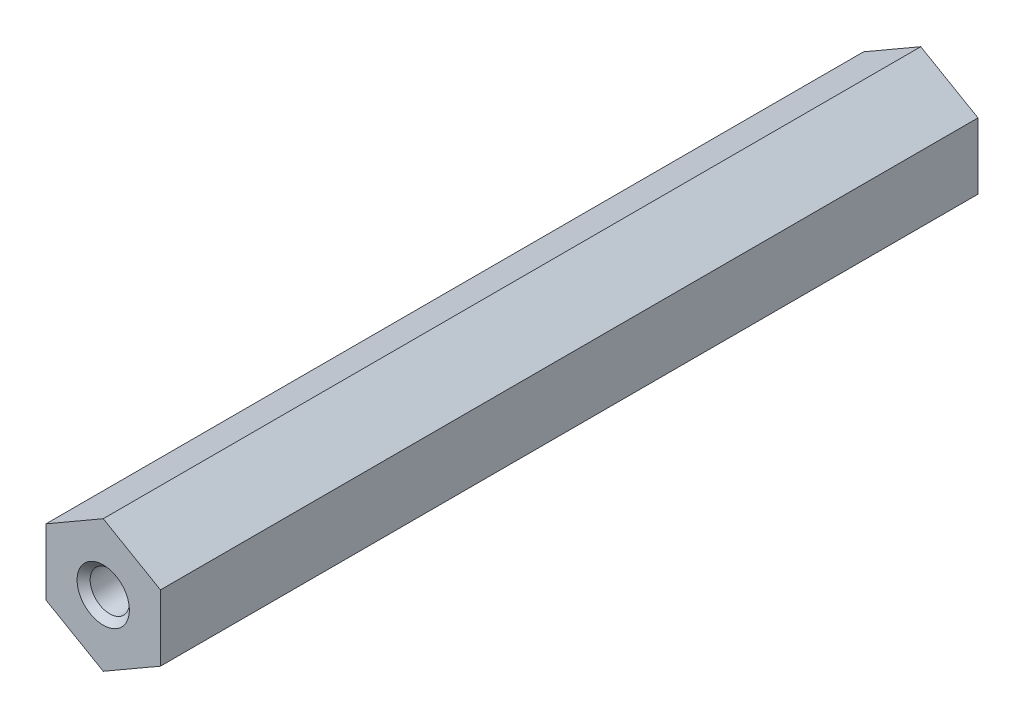
ISO-10303-21;
HEADER;
FILE_DESCRIPTION(('STEP AP214'),'2;1');
FILE_NAME('part.step','',(''),(''),'','','');
FILE_SCHEMA(('AUTOMOTIVE_DESIGN { 1 0 10303 214 1 1 1 1 }'));
ENDSEC;
DATA;
#1=APPLICATION_CONTEXT('core data for automotive mechanical design processes');
#2=APPLICATION_PROTOCOL_DEFINITION('international standard','automotive_design',2000,#1);
#3=PRODUCT_CONTEXT('',#1,'mechanical');
#4=PRODUCT('Part','Part','',(#3));
#5=PRODUCT_RELATED_PRODUCT_CATEGORY('part','',(#4));
#6=PRODUCT_DEFINITION_FORMATION('','',#4);
#7=PRODUCT_DEFINITION_CONTEXT('part definition',#1,'design');
#8=PRODUCT_DEFINITION('design','',#6,#7);
#9=PRODUCT_DEFINITION_SHAPE('','',#8);
#10=(LENGTH_UNIT() NAMED_UNIT(*) SI_UNIT(.MILLI.,.METRE.));
#11=(NAMED_UNIT(*) PLANE_ANGLE_UNIT() SI_UNIT($,.RADIAN.));
#12=(NAMED_UNIT(*) SI_UNIT($,.STERADIAN.) SOLID_ANGLE_UNIT());
#13=UNCERTAINTY_MEASURE_WITH_UNIT(LENGTH_MEASURE(1.E-05),#10,'distance_accuracy_value','');
#14=(GEOMETRIC_REPRESENTATION_CONTEXT(3) GLOBAL_UNCERTAINTY_ASSIGNED_CONTEXT((#13)) GLOBAL_UNIT_ASSIGNED_CONTEXT((#10,
#11,#12)) REPRESENTATION_CONTEXT('',''));
#15=CARTESIAN_POINT('',(0.,0.,0.));
#16=DIRECTION('',(0.,0.,1.));
#17=DIRECTION('',(1.,0.,0.));
#18=AXIS2_PLACEMENT_3D('',#15,#16,#17);
#19=CARTESIAN_POINT('',(3.5,2.02072594216369,50.));
#20=DIRECTION('',(-0.5,-0.866025403784439,0.));
#21=DIRECTION('',(0.866025403784439,-0.5,0.));
#22=AXIS2_PLACEMENT_3D('',#19,#20,#21);
#23=PLANE('',#22);
#24=DIRECTION('',(-0.866025403784439,0.5,0.));
#25=VECTOR('',#24,1.);
#26=CARTESIAN_POINT('',(3.5,2.02072594216369,0.));
#27=LINE('',#26,#25);
#28=CARTESIAN_POINT('',(3.5,2.02072594216369,0.));
#29=VERTEX_POINT('',#28);
#30=CARTESIAN_POINT('',(0.,4.04145188432738,0.));
#31=VERTEX_POINT('',#30);
#32=EDGE_CURVE('E154',#29,#31,#27,.T.);
#33=ORIENTED_EDGE('',*,*,#32,.T.);
#34=DIRECTION('',(0.,0.,-1.));
#35=VECTOR('',#34,1.);
#36=CARTESIAN_POINT('',(0.,4.04145188432738,50.));
#37=LINE('',#36,#35);
#38=CARTESIAN_POINT('',(0.,4.04145188432738,50.));
#39=VERTEX_POINT('',#38);
#40=EDGE_CURVE('E124',#39,#31,#37,.T.);
#41=ORIENTED_EDGE('',*,*,#40,.F.);
#42=DIRECTION('',(-0.866025403784439,0.5,0.));
#43=VECTOR('',#42,1.);
#44=CARTESIAN_POINT('',(3.5,2.02072594216369,50.));
#45=LINE('',#44,#43);
#46=CARTESIAN_POINT('',(3.5,2.02072594216369,50.));
#47=VERTEX_POINT('',#46);
#48=EDGE_CURVE('E173',#47,#39,#45,.T.);
#49=ORIENTED_EDGE('',*,*,#48,.F.);
#50=DIRECTION('',(0.,0.,-1.));
#51=VECTOR('',#50,1.);
#52=CARTESIAN_POINT('',(3.5,2.02072594216369,50.));
#53=LINE('',#52,#51);
#54=EDGE_CURVE('E174',#47,#29,#53,.T.);
#55=ORIENTED_EDGE('',*,*,#54,.T.);
#56=EDGE_LOOP('',(#33,#41,#49,#55));
#57=FACE_BOUND('',#56,.T.);
#58=ADVANCED_FACE('F36',(#57),#23,.F.);
#59=CARTESIAN_POINT('',(0.,4.04145188432738,50.));
#60=DIRECTION('',(0.5,-0.866025403784438,0.));
#61=DIRECTION('',(0.866025403784439,0.5,0.));
#62=AXIS2_PLACEMENT_3D('',#59,#60,#61);
#63=PLANE('',#62);
#64=DIRECTION('',(-0.866025403784438,-0.5,0.));
#65=VECTOR('',#64,1.);
#66=CARTESIAN_POINT('',(0.,4.04145188432738,0.));
#67=LINE('',#66,#65);
#68=CARTESIAN_POINT('',(-3.5,2.02072594216369,0.));
#69=VERTEX_POINT('',#68);
#70=EDGE_CURVE('E158',#31,#69,#67,.T.);
#71=ORIENTED_EDGE('',*,*,#70,.T.);
#72=DIRECTION('',(0.,0.,-1.));
#73=VECTOR('',#72,1.);
#74=CARTESIAN_POINT('',(-3.5,2.02072594216369,50.));
#75=LINE('',#74,#73);
#76=CARTESIAN_POINT('',(-3.5,2.02072594216369,50.));
#77=VERTEX_POINT('',#76);
#78=EDGE_CURVE('E130',#77,#69,#75,.T.);
#79=ORIENTED_EDGE('',*,*,#78,.F.);
#80=DIRECTION('',(-0.866025403784438,-0.5,0.));
#81=VECTOR('',#80,1.);
#82=CARTESIAN_POINT('',(0.,4.04145188432738,50.));
#83=LINE('',#82,#81);
#84=EDGE_CURVE('E209',#39,#77,#83,.T.);
#85=ORIENTED_EDGE('',*,*,#84,.F.);
#86=ORIENTED_EDGE('',*,*,#40,.T.);
#87=EDGE_LOOP('',(#71,#79,#85,#86));
#88=FACE_BOUND('',#87,.T.);
#89=ADVANCED_FACE('F99',(#88),#63,.F.);
#90=CARTESIAN_POINT('',(-3.5,2.02072594216369,50.));
#91=DIRECTION('',(1.,0.,0.));
#92=DIRECTION('',(0.,0.,-1.));
#93=AXIS2_PLACEMENT_3D('',#90,#91,#92);
#94=PLANE('',#93);
#95=DIRECTION('',(0.,-1.,0.));
#96=VECTOR('',#95,1.);
#97=CARTESIAN_POINT('',(-3.5,2.02072594216369,0.));
#98=LINE('',#97,#96);
#99=CARTESIAN_POINT('',(-3.5,-2.02072594216369,0.));
#100=VERTEX_POINT('',#99);
#101=EDGE_CURVE('E162',#69,#100,#98,.T.);
#102=ORIENTED_EDGE('',*,*,#101,.T.);
#103=DIRECTION('',(0.,0.,-1.));
#104=VECTOR('',#103,1.);
#105=CARTESIAN_POINT('',(-3.5,-2.02072594216369,50.));
#106=LINE('',#105,#104);
#107=CARTESIAN_POINT('',(-3.5,-2.02072594216369,50.));
#108=VERTEX_POINT('',#107);
#109=EDGE_CURVE('E182',#108,#100,#106,.T.);
#110=ORIENTED_EDGE('',*,*,#109,.F.);
#111=DIRECTION('',(0.,-1.,0.));
#112=VECTOR('',#111,1.);
#113=CARTESIAN_POINT('',(-3.5,2.02072594216369,50.));
#114=LINE('',#113,#112);
#115=EDGE_CURVE('E191',#77,#108,#114,.T.);
#116=ORIENTED_EDGE('',*,*,#115,.F.);
#117=ORIENTED_EDGE('',*,*,#78,.T.);
#118=EDGE_LOOP('',(#102,#110,#116,#117));
#119=FACE_BOUND('',#118,.T.);
#120=ADVANCED_FACE('F105',(#119),#94,.F.);
#121=CARTESIAN_POINT('',(-3.5,-2.02072594216369,50.));
#122=DIRECTION('',(0.5,0.866025403784438,0.));
#123=DIRECTION('',(-0.866025403784439,0.5,0.));
#124=AXIS2_PLACEMENT_3D('',#121,#122,#123);
#125=PLANE('',#124);
#126=DIRECTION('',(0.866025403784438,-0.5,0.));
#127=VECTOR('',#126,1.);
#128=CARTESIAN_POINT('',(-3.5,-2.02072594216369,0.));
#129=LINE('',#128,#127);
#130=CARTESIAN_POINT('',(0.,-4.04145188432738,0.));
#131=VERTEX_POINT('',#130);
#132=EDGE_CURVE('E168',#100,#131,#129,.T.);
#133=ORIENTED_EDGE('',*,*,#132,.T.);
#134=DIRECTION('',(0.,0.,-1.));
#135=VECTOR('',#134,1.);
#136=CARTESIAN_POINT('',(0.,-4.04145188432738,50.));
#137=LINE('',#136,#135);
#138=CARTESIAN_POINT('',(0.,-4.04145188432738,50.));
#139=VERTEX_POINT('',#138);
#140=EDGE_CURVE('E179',#139,#131,#137,.T.);
#141=ORIENTED_EDGE('',*,*,#140,.F.);
#142=DIRECTION('',(0.866025403784438,-0.5,0.));
#143=VECTOR('',#142,1.);
#144=CARTESIAN_POINT('',(-3.5,-2.02072594216369,50.));
#145=LINE('',#144,#143);
#146=EDGE_CURVE('E205',#108,#139,#145,.T.);
#147=ORIENTED_EDGE('',*,*,#146,.F.);
#148=ORIENTED_EDGE('',*,*,#109,.T.);
#149=EDGE_LOOP('',(#133,#141,#147,#148));
#150=FACE_BOUND('',#149,.T.);
#151=ADVANCED_FACE('F196',(#150),#125,.F.);
#152=CARTESIAN_POINT('',(0.,-4.04145188432738,50.));
#153=DIRECTION('',(-0.5,0.866025403784439,0.));
#154=DIRECTION('',(-0.866025403784439,-0.5,0.));
#155=AXIS2_PLACEMENT_3D('',#152,#153,#154);
#156=PLANE('',#155);
#157=DIRECTION('',(0.866025403784439,0.5,0.));
#158=VECTOR('',#157,1.);
#159=CARTESIAN_POINT('',(0.,-4.04145188432738,0.));
#160=LINE('',#159,#158);
#161=CARTESIAN_POINT('',(3.5,-2.02072594216369,0.));
#162=VERTEX_POINT('',#161);
#163=EDGE_CURVE('E170',#131,#162,#160,.T.);
#164=ORIENTED_EDGE('',*,*,#163,.T.);
#165=DIRECTION('',(0.,0.,-1.));
#166=VECTOR('',#165,1.);
#167=CARTESIAN_POINT('',(3.5,-2.02072594216369,50.));
#168=LINE('',#167,#166);
#169=CARTESIAN_POINT('',(3.5,-2.02072594216369,50.));
#170=VERTEX_POINT('',#169);
#171=EDGE_CURVE('E176',#170,#162,#168,.T.);
#172=ORIENTED_EDGE('',*,*,#171,.F.);
#173=DIRECTION('',(0.866025403784439,0.5,0.));
#174=VECTOR('',#173,1.);
#175=CARTESIAN_POINT('',(0.,-4.04145188432738,50.));
#176=LINE('',#175,#174);
#177=EDGE_CURVE('E202',#139,#170,#176,.T.);
#178=ORIENTED_EDGE('',*,*,#177,.F.);
#179=ORIENTED_EDGE('',*,*,#140,.T.);
#180=EDGE_LOOP('',(#164,#172,#178,#179));
#181=FACE_BOUND('',#180,.T.);
#182=ADVANCED_FACE('F200',(#181),#156,.F.);
#183=CARTESIAN_POINT('',(3.5,-2.02072594216369,50.));
#184=DIRECTION('',(-1.,0.,0.));
#185=DIRECTION('',(0.,-1.,0.));
#186=AXIS2_PLACEMENT_3D('',#183,#184,#185);
#187=PLANE('',#186);
#188=DIRECTION('',(0.,1.,0.));
#189=VECTOR('',#188,1.);
#190=CARTESIAN_POINT('',(3.5,-2.02072594216369,0.));
#191=LINE('',#190,#189);
#192=EDGE_CURVE('E156',#162,#29,#191,.T.);
#193=ORIENTED_EDGE('',*,*,#192,.T.);
#194=ORIENTED_EDGE('',*,*,#54,.F.);
#195=DIRECTION('',(0.,1.,0.));
#196=VECTOR('',#195,1.);
#197=CARTESIAN_POINT('',(3.5,-2.02072594216369,50.));
#198=LINE('',#197,#196);
#199=EDGE_CURVE('E53',#170,#47,#198,.T.);
#200=ORIENTED_EDGE('',*,*,#199,.F.);
#201=ORIENTED_EDGE('',*,*,#171,.T.);
#202=EDGE_LOOP('',(#193,#194,#200,#201));
#203=FACE_BOUND('',#202,.T.);
#204=ADVANCED_FACE('F215',(#203),#187,.F.);
#205=CARTESIAN_POINT('',(0.,4.04145188432738,50.));
#206=DIRECTION('',(0.,0.,1.));
#207=DIRECTION('',(1.,0.,0.));
#208=AXIS2_PLACEMENT_3D('',#205,#206,#207);
#209=PLANE('',#208);
#210=CARTESIAN_POINT('',(0.,0.,50.));
#211=DIRECTION('',(0.,0.,1.));
#212=DIRECTION('',(1.,0.,0.));
#213=AXIS2_PLACEMENT_3D('',#210,#211,#212);
#214=CIRCLE('',#213,1.60000000000001);
#215=CARTESIAN_POINT('',(1.60000000000001,0.,50.));
#216=VERTEX_POINT('',#215);
#217=EDGE_CURVE('E136',#216,#216,#214,.F.);
#218=ORIENTED_EDGE('',*,*,#217,.T.);
#219=EDGE_LOOP('',(#218));
#220=FACE_BOUND('',#219,.T.);
#221=ORIENTED_EDGE('',*,*,#48,.T.);
#222=ORIENTED_EDGE('',*,*,#84,.T.);
#223=ORIENTED_EDGE('',*,*,#115,.T.);
#224=ORIENTED_EDGE('',*,*,#146,.T.);
#225=ORIENTED_EDGE('',*,*,#177,.T.);
#226=ORIENTED_EDGE('',*,*,#199,.T.);
#227=EDGE_LOOP('',(#221,#222,#223,#224,#225,#226));
#228=FACE_BOUND('',#227,.T.);
#229=ADVANCED_FACE('F150',(#220,#228),#209,.T.);
#230=CARTESIAN_POINT('',(0.,4.04145188432738,0.));
#231=DIRECTION('',(0.,0.,1.));
#232=DIRECTION('',(1.,0.,0.));
#233=AXIS2_PLACEMENT_3D('',#230,#231,#232);
#234=PLANE('',#233);
#235=CARTESIAN_POINT('',(0.,0.,0.));
#236=DIRECTION('',(0.,0.,1.));
#237=DIRECTION('',(1.,0.,0.));
#238=AXIS2_PLACEMENT_3D('',#235,#236,#237);
#239=CIRCLE('',#238,2.5);
#240=CARTESIAN_POINT('',(2.5,0.,0.));
#241=VERTEX_POINT('',#240);
#242=EDGE_CURVE('E11',#241,#241,#239,.T.);
#243=ORIENTED_EDGE('',*,*,#242,.T.);
#244=EDGE_LOOP('',(#243));
#245=FACE_BOUND('',#244,.T.);
#246=ORIENTED_EDGE('',*,*,#32,.F.);
#247=ORIENTED_EDGE('',*,*,#192,.F.);
#248=ORIENTED_EDGE('',*,*,#163,.F.);
#249=ORIENTED_EDGE('',*,*,#132,.F.);
#250=ORIENTED_EDGE('',*,*,#101,.F.);
#251=ORIENTED_EDGE('',*,*,#70,.F.);
#252=EDGE_LOOP('',(#246,#247,#248,#249,#250,#251));
#253=FACE_BOUND('',#252,.T.);
#254=ADVANCED_FACE('F116',(#245,#253),#234,.F.);
#255=CARTESIAN_POINT('',(0.,0.,38.));
#256=DIRECTION('',(0.,0.,1.));
#257=DIRECTION('',(1.,0.,0.));
#258=AXIS2_PLACEMENT_3D('',#255,#256,#257);
#259=CYLINDRICAL_SURFACE('',#258,1.2);
#260=CARTESIAN_POINT('',(0.,0.,49.6));
#261=DIRECTION('',(0.,0.,1.));
#262=DIRECTION('',(1.,0.,0.));
#263=AXIS2_PLACEMENT_3D('',#260,#261,#262);
#264=CIRCLE('',#263,1.2);
#265=CARTESIAN_POINT('',(1.2,0.,49.6));
#266=VERTEX_POINT('',#265);
#267=EDGE_CURVE('E127',#266,#266,#264,.T.);
#268=ORIENTED_EDGE('',*,*,#267,.T.);
#269=EDGE_LOOP('',(#268));
#270=FACE_BOUND('',#269,.T.);
#271=CARTESIAN_POINT('',(0.,0.,38.6928203230276));
#272=DIRECTION('',(0.,0.,1.));
#273=DIRECTION('',(1.,0.,0.));
#274=AXIS2_PLACEMENT_3D('',#271,#272,#273);
#275=CIRCLE('',#274,1.2);
#276=CARTESIAN_POINT('',(1.2,0.,38.6928203230276));
#277=VERTEX_POINT('',#276);
#278=EDGE_CURVE('E121',#277,#277,#275,.F.);
#279=ORIENTED_EDGE('',*,*,#278,.T.);
#280=EDGE_LOOP('',(#279));
#281=FACE_BOUND('',#280,.T.);
#282=ADVANCED_FACE('F111',(#270,#281),#259,.F.);
#283=CARTESIAN_POINT('',(0.,0.,38.6928203230276));
#284=DIRECTION('',(0.,0.,1.));
#285=DIRECTION('',(1.,0.,0.));
#286=AXIS2_PLACEMENT_3D('',#283,#284,#285);
#287=CONICAL_SURFACE('',#286,1.19999999999998,1.04719755119659);
#288=ORIENTED_EDGE('',*,*,#278,.F.);
#289=EDGE_LOOP('',(#288));
#290=FACE_BOUND('',#289,.T.);
#291=CARTESIAN_POINT('',(0.,0.,38.));
#292=VERTEX_POINT('',#291);
#293=VERTEX_LOOP('',#292);
#294=FACE_BOUND('',#293,.T.);
#295=ADVANCED_FACE('F93',(#290,#294),#287,.F.);
#296=CARTESIAN_POINT('',(0.,0.,12.));
#297=DIRECTION('',(0.,0.,-1.));
#298=DIRECTION('',(-1.,0.,0.));
#299=AXIS2_PLACEMENT_3D('',#296,#297,#298);
#300=CYLINDRICAL_SURFACE('',#299,2.1);
#301=CARTESIAN_POINT('',(0.,0.,0.399999999999994));
#302=DIRECTION('',(0.,0.,1.));
#303=DIRECTION('',(1.,0.,0.));
#304=AXIS2_PLACEMENT_3D('',#301,#302,#303);
#305=CIRCLE('',#304,2.1);
#306=CARTESIAN_POINT('',(2.1,0.,0.399999999999994));
#307=VERTEX_POINT('',#306);
#308=EDGE_CURVE('E45',#307,#307,#305,.F.);
#309=ORIENTED_EDGE('',*,*,#308,.T.);
#310=EDGE_LOOP('',(#309));
#311=FACE_BOUND('',#310,.T.);
#312=CARTESIAN_POINT('',(0.,0.,10.7875644347018));
#313=DIRECTION('',(0.,0.,-1.));
#314=DIRECTION('',(-1.,0.,0.));
#315=AXIS2_PLACEMENT_3D('',#312,#313,#314);
#316=CIRCLE('',#315,2.1);
#317=CARTESIAN_POINT('',(-2.1,0.,10.7875644347018));
#318=VERTEX_POINT('',#317);
#319=EDGE_CURVE('E123',#318,#318,#316,.F.);
#320=ORIENTED_EDGE('',*,*,#319,.T.);
#321=EDGE_LOOP('',(#320));
#322=FACE_BOUND('',#321,.T.);
#323=ADVANCED_FACE('F85',(#311,#322),#300,.F.);
#324=CARTESIAN_POINT('',(0.,0.,10.7875644347018));
#325=DIRECTION('',(0.,0.,-1.));
#326=DIRECTION('',(-1.,0.,0.));
#327=AXIS2_PLACEMENT_3D('',#324,#325,#326);
#328=CONICAL_SURFACE('',#327,2.09999999999999,1.04719755119659);
#329=ORIENTED_EDGE('',*,*,#319,.F.);
#330=EDGE_LOOP('',(#329));
#331=FACE_BOUND('',#330,.T.);
#332=CARTESIAN_POINT('',(0.,0.,12.));
#333=VERTEX_POINT('',#332);
#334=VERTEX_LOOP('',#333);
#335=FACE_BOUND('',#334,.T.);
#336=ADVANCED_FACE('F82',(#331,#335),#328,.F.);
#337=CARTESIAN_POINT('',(0.,0.,49.6));
#338=DIRECTION('',(0.,0.,1.));
#339=DIRECTION('',(1.,0.,0.));
#340=AXIS2_PLACEMENT_3D('',#337,#338,#339);
#341=CONICAL_SURFACE('',#340,1.2,0.785398163397448);
#342=ORIENTED_EDGE('',*,*,#217,.F.);
#343=EDGE_LOOP('',(#342));
#344=FACE_BOUND('',#343,.T.);
#345=ORIENTED_EDGE('',*,*,#267,.F.);
#346=EDGE_LOOP('',(#345));
#347=FACE_BOUND('',#346,.T.);
#348=ADVANCED_FACE('F84',(#344,#347),#341,.F.);
#349=CARTESIAN_POINT('',(0.,0.,0.399999999999994));
#350=DIRECTION('',(0.,0.,-1.));
#351=DIRECTION('',(-1.,0.,0.));
#352=AXIS2_PLACEMENT_3D('',#349,#350,#351);
#353=CONICAL_SURFACE('',#352,2.1,0.785398163397458);
#354=ORIENTED_EDGE('',*,*,#242,.F.);
#355=EDGE_LOOP('',(#354));
#356=FACE_BOUND('',#355,.T.);
#357=ORIENTED_EDGE('',*,*,#308,.F.);
#358=EDGE_LOOP('',(#357));
#359=FACE_BOUND('',#358,.T.);
#360=ADVANCED_FACE('F38',(#356,#359),#353,.F.);
#361=CLOSED_SHELL('',(#58,#89,#120,#151,#182,#204,#229,#254,#282,#295,#323,#336,#348,#360));
#362=MANIFOLD_SOLID_BREP('B2',#361);
#363=ADVANCED_BREP_SHAPE_REPRESENTATION('',(#18,#362),#14);
#364=SHAPE_DEFINITION_REPRESENTATION(#9,#363);
ENDSEC;
END-ISO-10303-21;
